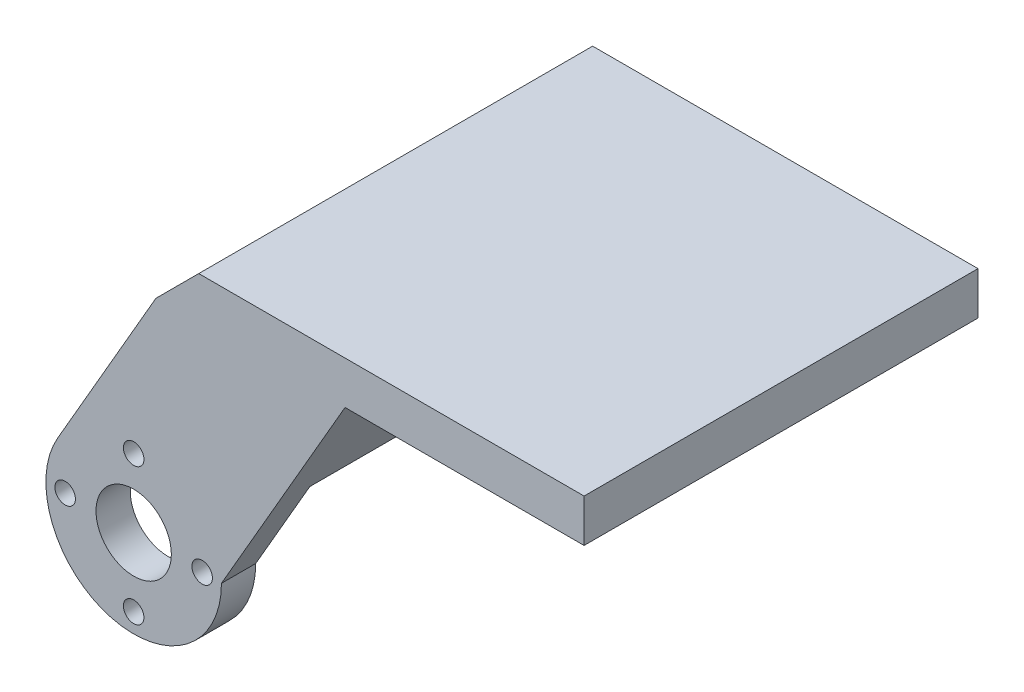
ISO-10303-21;
HEADER;
FILE_DESCRIPTION(('STEP AP214'),'2;1');
FILE_NAME('part.step','',(''),(''),'','','');
FILE_SCHEMA(('AUTOMOTIVE_DESIGN { 1 0 10303 214 1 1 1 1 }'));
ENDSEC;
DATA;
#1=APPLICATION_CONTEXT('core data for automotive mechanical design processes');
#2=APPLICATION_PROTOCOL_DEFINITION('international standard','automotive_design',2000,#1);
#3=PRODUCT_CONTEXT('',#1,'mechanical');
#4=PRODUCT('Part','Part','',(#3));
#5=PRODUCT_RELATED_PRODUCT_CATEGORY('part','',(#4));
#6=PRODUCT_DEFINITION_FORMATION('','',#4);
#7=PRODUCT_DEFINITION_CONTEXT('part definition',#1,'design');
#8=PRODUCT_DEFINITION('design','',#6,#7);
#9=PRODUCT_DEFINITION_SHAPE('','',#8);
#10=(LENGTH_UNIT() NAMED_UNIT(*) SI_UNIT(.MILLI.,.METRE.));
#11=(NAMED_UNIT(*) PLANE_ANGLE_UNIT() SI_UNIT($,.RADIAN.));
#12=(NAMED_UNIT(*) SI_UNIT($,.STERADIAN.) SOLID_ANGLE_UNIT());
#13=UNCERTAINTY_MEASURE_WITH_UNIT(LENGTH_MEASURE(1.E-05),#10,'distance_accuracy_value','');
#14=(GEOMETRIC_REPRESENTATION_CONTEXT(3) GLOBAL_UNCERTAINTY_ASSIGNED_CONTEXT((#13)) GLOBAL_UNIT_ASSIGNED_CONTEXT((#10,
#11,#12)) REPRESENTATION_CONTEXT('',''));
#15=CARTESIAN_POINT('',(0.,0.,0.));
#16=DIRECTION('',(0.,0.,1.));
#17=DIRECTION('',(1.,0.,0.));
#18=AXIS2_PLACEMENT_3D('',#15,#16,#17);
#19=CARTESIAN_POINT('',(0.,0.,-46.));
#20=DIRECTION('',(0.,0.,1.));
#21=DIRECTION('',(1.,0.,0.));
#22=AXIS2_PLACEMENT_3D('',#19,#20,#21);
#23=CYLINDRICAL_SURFACE('',#22,10.25);
#24=CARTESIAN_POINT('',(0.,0.,-4.));
#25=DIRECTION('',(0.,0.,1.));
#26=DIRECTION('',(0.,-1.,0.));
#27=AXIS2_PLACEMENT_3D('',#24,#25,#26);
#28=CIRCLE('',#27,10.25);
#29=CARTESIAN_POINT('',(10.25,0.,-4.));
#30=VERTEX_POINT('',#29);
#31=CARTESIAN_POINT('',(-8.87676038879048,5.12500000000004,-4.));
#32=VERTEX_POINT('',#31);
#33=EDGE_CURVE('E139',#30,#32,#28,.F.);
#34=ORIENTED_EDGE('',*,*,#33,.F.);
#35=DIRECTION('',(0.,0.,1.));
#36=VECTOR('',#35,1.);
#37=CARTESIAN_POINT('',(10.25,0.,-46.));
#38=LINE('',#37,#36);
#39=CARTESIAN_POINT('',(10.25,0.,0.));
#40=VERTEX_POINT('',#39);
#41=EDGE_CURVE('E254',#30,#40,#38,.T.);
#42=ORIENTED_EDGE('',*,*,#41,.T.);
#43=CARTESIAN_POINT('',(0.,0.,0.));
#44=DIRECTION('',(0.,0.,1.));
#45=DIRECTION('',(1.,0.,0.));
#46=AXIS2_PLACEMENT_3D('',#43,#44,#45);
#47=CIRCLE('',#46,10.25);
#48=CARTESIAN_POINT('',(-8.87676038879047,5.12500000000004,0.));
#49=VERTEX_POINT('',#48);
#50=EDGE_CURVE('E274',#49,#40,#47,.T.);
#51=ORIENTED_EDGE('',*,*,#50,.F.);
#52=DIRECTION('',(0.,0.,1.));
#53=VECTOR('',#52,1.);
#54=CARTESIAN_POINT('',(-8.87676038879047,5.12500000000004,-46.));
#55=LINE('',#54,#53);
#56=EDGE_CURVE('E299',#32,#49,#55,.T.);
#57=ORIENTED_EDGE('',*,*,#56,.F.);
#58=EDGE_LOOP('',(#34,#42,#51,#57));
#59=FACE_BOUND('',#58,.T.);
#60=ADVANCED_FACE('F49',(#59),#23,.T.);
#61=CARTESIAN_POINT('',(0.,8.,-46.));
#62=DIRECTION('',(0.,0.,1.));
#63=DIRECTION('',(1.,0.,0.));
#64=AXIS2_PLACEMENT_3D('',#61,#62,#63);
#65=CYLINDRICAL_SURFACE('',#64,1.2);
#66=CARTESIAN_POINT('',(0.,8.,-4.));
#67=DIRECTION('',(0.,0.,1.));
#68=DIRECTION('',(0.,-1.,0.));
#69=AXIS2_PLACEMENT_3D('',#66,#67,#68);
#70=CIRCLE('',#69,1.2);
#71=CARTESIAN_POINT('',(0.,6.8,-4.));
#72=VERTEX_POINT('',#71);
#73=EDGE_CURVE('E206',#72,#72,#70,.F.);
#74=ORIENTED_EDGE('',*,*,#73,.T.);
#75=EDGE_LOOP('',(#74));
#76=FACE_BOUND('',#75,.T.);
#77=CARTESIAN_POINT('',(0.,8.,0.));
#78=DIRECTION('',(0.,0.,1.));
#79=DIRECTION('',(1.,0.,0.));
#80=AXIS2_PLACEMENT_3D('',#77,#78,#79);
#81=CIRCLE('',#80,1.2);
#82=CARTESIAN_POINT('',(1.2,8.,0.));
#83=VERTEX_POINT('',#82);
#84=EDGE_CURVE('E270',#83,#83,#81,.T.);
#85=ORIENTED_EDGE('',*,*,#84,.T.);
#86=EDGE_LOOP('',(#85));
#87=FACE_BOUND('',#86,.T.);
#88=ADVANCED_FACE('F374',(#76,#87),#65,.F.);
#89=CARTESIAN_POINT('',(-8.,0.,-46.));
#90=DIRECTION('',(0.,0.,1.));
#91=DIRECTION('',(1.,0.,0.));
#92=AXIS2_PLACEMENT_3D('',#89,#90,#91);
#93=CYLINDRICAL_SURFACE('',#92,1.2);
#94=CARTESIAN_POINT('',(-8.,0.,-4.));
#95=DIRECTION('',(0.,0.,1.));
#96=DIRECTION('',(0.,-1.,0.));
#97=AXIS2_PLACEMENT_3D('',#94,#95,#96);
#98=CIRCLE('',#97,1.2);
#99=CARTESIAN_POINT('',(-8.,-1.19999999999992,-4.));
#100=VERTEX_POINT('',#99);
#101=EDGE_CURVE('E202',#100,#100,#98,.F.);
#102=ORIENTED_EDGE('',*,*,#101,.T.);
#103=EDGE_LOOP('',(#102));
#104=FACE_BOUND('',#103,.T.);
#105=CARTESIAN_POINT('',(-8.,0.,0.));
#106=DIRECTION('',(0.,0.,1.));
#107=DIRECTION('',(1.,0.,0.));
#108=AXIS2_PLACEMENT_3D('',#105,#106,#107);
#109=CIRCLE('',#108,1.2);
#110=CARTESIAN_POINT('',(-6.8,0.,0.));
#111=VERTEX_POINT('',#110);
#112=EDGE_CURVE('E266',#111,#111,#109,.T.);
#113=ORIENTED_EDGE('',*,*,#112,.T.);
#114=EDGE_LOOP('',(#113));
#115=FACE_BOUND('',#114,.T.);
#116=ADVANCED_FACE('F379',(#104,#115),#93,.F.);
#117=CARTESIAN_POINT('',(0.,-8.,-46.));
#118=DIRECTION('',(0.,0.,1.));
#119=DIRECTION('',(1.,0.,0.));
#120=AXIS2_PLACEMENT_3D('',#117,#118,#119);
#121=CYLINDRICAL_SURFACE('',#120,1.2);
#122=CARTESIAN_POINT('',(0.,-8.,-4.));
#123=DIRECTION('',(0.,0.,1.));
#124=DIRECTION('',(0.,-1.,0.));
#125=AXIS2_PLACEMENT_3D('',#122,#123,#124);
#126=CIRCLE('',#125,1.2);
#127=CARTESIAN_POINT('',(0.,-9.2,-4.));
#128=VERTEX_POINT('',#127);
#129=EDGE_CURVE('E198',#128,#128,#126,.F.);
#130=ORIENTED_EDGE('',*,*,#129,.T.);
#131=EDGE_LOOP('',(#130));
#132=FACE_BOUND('',#131,.T.);
#133=CARTESIAN_POINT('',(0.,-8.,0.));
#134=DIRECTION('',(0.,0.,1.));
#135=DIRECTION('',(1.,0.,0.));
#136=AXIS2_PLACEMENT_3D('',#133,#134,#135);
#137=CIRCLE('',#136,1.2);
#138=CARTESIAN_POINT('',(1.19999999999994,-8.,0.));
#139=VERTEX_POINT('',#138);
#140=EDGE_CURVE('E262',#139,#139,#137,.T.);
#141=ORIENTED_EDGE('',*,*,#140,.T.);
#142=EDGE_LOOP('',(#141));
#143=FACE_BOUND('',#142,.T.);
#144=ADVANCED_FACE('F397',(#132,#143),#121,.F.);
#145=CARTESIAN_POINT('',(8.,0.,-46.));
#146=DIRECTION('',(0.,0.,1.));
#147=DIRECTION('',(1.,0.,0.));
#148=AXIS2_PLACEMENT_3D('',#145,#146,#147);
#149=CYLINDRICAL_SURFACE('',#148,1.2);
#150=CARTESIAN_POINT('',(8.,0.,-4.));
#151=DIRECTION('',(0.,0.,1.));
#152=DIRECTION('',(0.,-1.,0.));
#153=AXIS2_PLACEMENT_3D('',#150,#151,#152);
#154=CIRCLE('',#153,1.2);
#155=CARTESIAN_POINT('',(8.,-1.20000000000003,-4.));
#156=VERTEX_POINT('',#155);
#157=EDGE_CURVE('E194',#156,#156,#154,.F.);
#158=ORIENTED_EDGE('',*,*,#157,.T.);
#159=EDGE_LOOP('',(#158));
#160=FACE_BOUND('',#159,.T.);
#161=CARTESIAN_POINT('',(8.,0.,0.));
#162=DIRECTION('',(0.,0.,1.));
#163=DIRECTION('',(1.,0.,0.));
#164=AXIS2_PLACEMENT_3D('',#161,#162,#163);
#165=CIRCLE('',#164,1.2);
#166=CARTESIAN_POINT('',(9.2,0.,0.));
#167=VERTEX_POINT('',#166);
#168=EDGE_CURVE('E258',#167,#167,#165,.T.);
#169=ORIENTED_EDGE('',*,*,#168,.T.);
#170=EDGE_LOOP('',(#169));
#171=FACE_BOUND('',#170,.T.);
#172=ADVANCED_FACE('F391',(#160,#171),#149,.F.);
#173=CARTESIAN_POINT('',(0.,0.,-46.));
#174=DIRECTION('',(0.,0.,1.));
#175=DIRECTION('',(1.,0.,0.));
#176=AXIS2_PLACEMENT_3D('',#173,#174,#175);
#177=CYLINDRICAL_SURFACE('',#176,4.4);
#178=CARTESIAN_POINT('',(0.,0.,-4.));
#179=DIRECTION('',(0.,0.,1.));
#180=DIRECTION('',(0.,-1.,0.));
#181=AXIS2_PLACEMENT_3D('',#178,#179,#180);
#182=CIRCLE('',#181,4.4);
#183=CARTESIAN_POINT('',(0.,-4.4,-4.));
#184=VERTEX_POINT('',#183);
#185=EDGE_CURVE('E190',#184,#184,#182,.F.);
#186=ORIENTED_EDGE('',*,*,#185,.T.);
#187=EDGE_LOOP('',(#186));
#188=FACE_BOUND('',#187,.T.);
#189=CARTESIAN_POINT('',(0.,0.,0.));
#190=DIRECTION('',(0.,0.,1.));
#191=DIRECTION('',(1.,0.,0.));
#192=AXIS2_PLACEMENT_3D('',#189,#190,#191);
#193=CIRCLE('',#192,4.4);
#194=CARTESIAN_POINT('',(4.4,0.,0.));
#195=VERTEX_POINT('',#194);
#196=EDGE_CURVE('E210',#195,#195,#193,.T.);
#197=ORIENTED_EDGE('',*,*,#196,.T.);
#198=EDGE_LOOP('',(#197));
#199=FACE_BOUND('',#198,.T.);
#200=ADVANCED_FACE('F384',(#188,#199),#177,.F.);
#201=CARTESIAN_POINT('',(10.25,0.,-46.));
#202=VERTEX_POINT('',#201);
#203=CARTESIAN_POINT('',(10.25,0.,-42.));
#204=VERTEX_POINT('',#203);
#205=EDGE_CURVE('E313',#202,#204,#38,.T.);
#206=ORIENTED_EDGE('',*,*,#205,.T.);
#207=CARTESIAN_POINT('',(0.,0.,-42.));
#208=DIRECTION('',(0.,0.,-1.));
#209=DIRECTION('',(-1.,0.,0.));
#210=AXIS2_PLACEMENT_3D('',#207,#208,#209);
#211=CIRCLE('',#210,10.25);
#212=CARTESIAN_POINT('',(-8.87676038879048,5.12500000000004,-42.));
#213=VERTEX_POINT('',#212);
#214=EDGE_CURVE('E164',#213,#204,#211,.F.);
#215=ORIENTED_EDGE('',*,*,#214,.F.);
#216=CARTESIAN_POINT('',(-8.87676038879047,5.12500000000004,-46.));
#217=VERTEX_POINT('',#216);
#218=EDGE_CURVE('E296',#217,#213,#55,.T.);
#219=ORIENTED_EDGE('',*,*,#218,.F.);
#220=CARTESIAN_POINT('',(0.,0.,-46.));
#221=DIRECTION('',(0.,0.,1.));
#222=DIRECTION('',(1.,0.,0.));
#223=AXIS2_PLACEMENT_3D('',#220,#221,#222);
#224=CIRCLE('',#223,10.25);
#225=EDGE_CURVE('E232',#217,#202,#224,.T.);
#226=ORIENTED_EDGE('',*,*,#225,.T.);
#227=EDGE_LOOP('',(#206,#215,#219,#226));
#228=FACE_BOUND('',#227,.T.);
#229=ADVANCED_FACE('F355',(#228),#23,.T.);
#230=CARTESIAN_POINT('',(-8.87676038879048,5.12500000000004,-46.));
#231=DIRECTION('',(0.866025403784436,-0.500000000000004,0.));
#232=DIRECTION('',(0.500000000000004,0.866025403784436,0.));
#233=AXIS2_PLACEMENT_3D('',#230,#231,#232);
#234=PLANE('',#233);
#235=DIRECTION('',(0.,0.,-1.));
#236=VECTOR('',#235,1.);
#237=CARTESIAN_POINT('',(-0.00176038879040434,20.4969509171738,-4.));
#238=LINE('',#237,#236);
#239=CARTESIAN_POINT('',(-0.00176038879040434,20.4969509171738,-4.));
#240=VERTEX_POINT('',#239);
#241=CARTESIAN_POINT('',(-0.00176038879040608,20.4969509171738,-42.));
#242=VERTEX_POINT('',#241);
#243=EDGE_CURVE('E144',#240,#242,#238,.T.);
#244=ORIENTED_EDGE('',*,*,#243,.F.);
#245=DIRECTION('',(0.500000000000004,0.866025403784436,0.));
#246=VECTOR('',#245,1.);
#247=CARTESIAN_POINT('',(-14.0017603887905,-3.75176038879043,-4.));
#248=LINE('',#247,#246);
#249=EDGE_CURVE('E132',#32,#240,#248,.T.);
#250=ORIENTED_EDGE('',*,*,#249,.F.);
#251=ORIENTED_EDGE('',*,*,#56,.T.);
#252=DIRECTION('',(0.500000000000004,0.866025403784436,0.));
#253=VECTOR('',#252,1.);
#254=CARTESIAN_POINT('',(-8.87676038879048,5.12500000000004,0.));
#255=LINE('',#254,#253);
#256=CARTESIAN_POINT('',(2.59807621135343,25.,0.));
#257=VERTEX_POINT('',#256);
#258=EDGE_CURVE('E216',#49,#257,#255,.T.);
#259=ORIENTED_EDGE('',*,*,#258,.T.);
#260=DIRECTION('',(0.,0.,1.));
#261=VECTOR('',#260,1.);
#262=CARTESIAN_POINT('',(2.59807621135343,25.,-46.));
#263=LINE('',#262,#261);
#264=CARTESIAN_POINT('',(2.59807621135343,25.,-46.));
#265=VERTEX_POINT('',#264);
#266=EDGE_CURVE('E300',#265,#257,#263,.T.);
#267=ORIENTED_EDGE('',*,*,#266,.F.);
#268=DIRECTION('',(0.500000000000004,0.866025403784436,0.));
#269=VECTOR('',#268,1.);
#270=CARTESIAN_POINT('',(-8.87676038879048,5.12500000000004,-46.));
#271=LINE('',#270,#269);
#272=EDGE_CURVE('E251',#217,#265,#271,.T.);
#273=ORIENTED_EDGE('',*,*,#272,.F.);
#274=ORIENTED_EDGE('',*,*,#218,.T.);
#275=DIRECTION('',(-0.500000000000004,-0.866025403784436,0.));
#276=VECTOR('',#275,1.);
#277=CARTESIAN_POINT('',(-14.0017603887905,-3.75176038879043,-42.));
#278=LINE('',#277,#276);
#279=EDGE_CURVE('E154',#242,#213,#278,.T.);
#280=ORIENTED_EDGE('',*,*,#279,.F.);
#281=EDGE_LOOP('',(#244,#250,#251,#259,#267,#273,#274,#280));
#282=FACE_BOUND('',#281,.T.);
#283=ADVANCED_FACE('F156',(#282),#234,.F.);
#284=CARTESIAN_POINT('',(0.,30.,-46.));
#285=DIRECTION('',(0.,-1.,0.));
#286=DIRECTION('',(1.,0.,0.));
#287=AXIS2_PLACEMENT_3D('',#284,#285,#286);
#288=PLANE('',#287);
#289=DIRECTION('',(1.,0.,0.));
#290=VECTOR('',#289,1.);
#291=CARTESIAN_POINT('',(0.,30.,-46.));
#292=LINE('',#291,#290);
#293=CARTESIAN_POINT('',(7.59807621135343,30.,-46.));
#294=VERTEX_POINT('',#293);
#295=CARTESIAN_POINT('',(52.5980762113534,30.,-46.));
#296=VERTEX_POINT('',#295);
#297=EDGE_CURVE('E248',#294,#296,#292,.T.);
#298=ORIENTED_EDGE('',*,*,#297,.F.);
#299=DIRECTION('',(0.,0.,1.));
#300=VECTOR('',#299,1.);
#301=CARTESIAN_POINT('',(7.59807621135343,30.,-46.));
#302=LINE('',#301,#300);
#303=CARTESIAN_POINT('',(7.59807621135343,30.,0.));
#304=VERTEX_POINT('',#303);
#305=EDGE_CURVE('E326',#294,#304,#302,.T.);
#306=ORIENTED_EDGE('',*,*,#305,.T.);
#307=DIRECTION('',(1.,0.,0.));
#308=VECTOR('',#307,1.);
#309=CARTESIAN_POINT('',(0.,30.,0.));
#310=LINE('',#309,#308);
#311=CARTESIAN_POINT('',(52.5980762113534,30.,0.));
#312=VERTEX_POINT('',#311);
#313=EDGE_CURVE('E290',#304,#312,#310,.T.);
#314=ORIENTED_EDGE('',*,*,#313,.T.);
#315=DIRECTION('',(0.,0.,1.));
#316=VECTOR('',#315,1.);
#317=CARTESIAN_POINT('',(52.5980762113534,30.,-46.));
#318=LINE('',#317,#316);
#319=EDGE_CURVE('E303',#296,#312,#318,.T.);
#320=ORIENTED_EDGE('',*,*,#319,.F.);
#321=EDGE_LOOP('',(#298,#306,#314,#320));
#322=FACE_BOUND('',#321,.T.);
#323=ADVANCED_FACE('F337',(#322),#288,.F.);
#324=CARTESIAN_POINT('',(52.5980762113535,0.,-46.));
#325=DIRECTION('',(1.,0.,0.));
#326=DIRECTION('',(0.,1.,0.));
#327=AXIS2_PLACEMENT_3D('',#324,#325,#326);
#328=PLANE('',#327);
#329=DIRECTION('',(0.,1.,0.));
#330=VECTOR('',#329,1.);
#331=CARTESIAN_POINT('',(52.5980762113535,0.,0.));
#332=LINE('',#331,#330);
#333=CARTESIAN_POINT('',(52.5980762113534,25.,0.));
#334=VERTEX_POINT('',#333);
#335=EDGE_CURVE('E286',#334,#312,#332,.T.);
#336=ORIENTED_EDGE('',*,*,#335,.F.);
#337=DIRECTION('',(0.,0.,1.));
#338=VECTOR('',#337,1.);
#339=CARTESIAN_POINT('',(52.5980762113534,25.,-46.));
#340=LINE('',#339,#338);
#341=CARTESIAN_POINT('',(52.5980762113534,25.,-46.));
#342=VERTEX_POINT('',#341);
#343=EDGE_CURVE('E307',#342,#334,#340,.T.);
#344=ORIENTED_EDGE('',*,*,#343,.F.);
#345=DIRECTION('',(0.,1.,0.));
#346=VECTOR('',#345,1.);
#347=CARTESIAN_POINT('',(52.5980762113535,0.,-46.));
#348=LINE('',#347,#346);
#349=EDGE_CURVE('E244',#342,#296,#348,.T.);
#350=ORIENTED_EDGE('',*,*,#349,.T.);
#351=ORIENTED_EDGE('',*,*,#319,.T.);
#352=EDGE_LOOP('',(#336,#344,#350,#351));
#353=FACE_BOUND('',#352,.T.);
#354=ADVANCED_FACE('F363',(#353),#328,.T.);
#355=CARTESIAN_POINT('',(0.,25.,-46.));
#356=DIRECTION('',(0.,-1.,0.));
#357=DIRECTION('',(0.,0.,-1.));
#358=AXIS2_PLACEMENT_3D('',#355,#356,#357);
#359=PLANE('',#358);
#360=DIRECTION('',(1.,0.,0.));
#361=VECTOR('',#360,1.);
#362=CARTESIAN_POINT('',(0.,25.,0.));
#363=LINE('',#362,#361);
#364=CARTESIAN_POINT('',(24.6837567297408,25.,0.));
#365=VERTEX_POINT('',#364);
#366=EDGE_CURVE('E282',#365,#334,#363,.T.);
#367=ORIENTED_EDGE('',*,*,#366,.F.);
#368=DIRECTION('',(0.,0.,1.));
#369=VECTOR('',#368,1.);
#370=CARTESIAN_POINT('',(24.6837567297408,25.,-46.));
#371=LINE('',#370,#369);
#372=CARTESIAN_POINT('',(24.6837567297408,25.,-46.));
#373=VERTEX_POINT('',#372);
#374=EDGE_CURVE('E310',#373,#365,#371,.T.);
#375=ORIENTED_EDGE('',*,*,#374,.F.);
#376=DIRECTION('',(1.,0.,0.));
#377=VECTOR('',#376,1.);
#378=CARTESIAN_POINT('',(0.,25.,-46.));
#379=LINE('',#378,#377);
#380=EDGE_CURVE('E240',#373,#342,#379,.T.);
#381=ORIENTED_EDGE('',*,*,#380,.T.);
#382=ORIENTED_EDGE('',*,*,#343,.T.);
#383=EDGE_LOOP('',(#367,#375,#381,#382));
#384=FACE_BOUND('',#383,.T.);
#385=ADVANCED_FACE('F346',(#384),#359,.T.);
#386=CARTESIAN_POINT('',(0.,8.,-42.));
#387=DIRECTION('',(0.,0.,-1.));
#388=DIRECTION('',(-1.,0.,0.));
#389=AXIS2_PLACEMENT_3D('',#386,#387,#388);
#390=CIRCLE('',#389,1.2);
#391=CARTESIAN_POINT('',(-1.2,8.,-42.));
#392=VERTEX_POINT('',#391);
#393=EDGE_CURVE('E184',#392,#392,#390,.F.);
#394=ORIENTED_EDGE('',*,*,#393,.T.);
#395=EDGE_LOOP('',(#394));
#396=FACE_BOUND('',#395,.T.);
#397=CARTESIAN_POINT('',(0.,8.,-46.));
#398=DIRECTION('',(0.,0.,1.));
#399=DIRECTION('',(1.,0.,0.));
#400=AXIS2_PLACEMENT_3D('',#397,#398,#399);
#401=CIRCLE('',#400,1.2);
#402=CARTESIAN_POINT('',(1.2,8.,-46.));
#403=VERTEX_POINT('',#402);
#404=EDGE_CURVE('E228',#403,#403,#401,.T.);
#405=ORIENTED_EDGE('',*,*,#404,.F.);
#406=EDGE_LOOP('',(#405));
#407=FACE_BOUND('',#406,.T.);
#408=ADVANCED_FACE('F369',(#396,#407),#65,.F.);
#409=CARTESIAN_POINT('',(-8.,0.,-42.));
#410=DIRECTION('',(0.,0.,-1.));
#411=DIRECTION('',(-1.,0.,0.));
#412=AXIS2_PLACEMENT_3D('',#409,#410,#411);
#413=CIRCLE('',#412,1.2);
#414=CARTESIAN_POINT('',(-9.2,0.,-42.));
#415=VERTEX_POINT('',#414);
#416=EDGE_CURVE('E180',#415,#415,#413,.F.);
#417=ORIENTED_EDGE('',*,*,#416,.T.);
#418=EDGE_LOOP('',(#417));
#419=FACE_BOUND('',#418,.T.);
#420=CARTESIAN_POINT('',(-8.,0.,-46.));
#421=DIRECTION('',(0.,0.,1.));
#422=DIRECTION('',(1.,0.,0.));
#423=AXIS2_PLACEMENT_3D('',#420,#421,#422);
#424=CIRCLE('',#423,1.2);
#425=CARTESIAN_POINT('',(-6.8,0.,-46.));
#426=VERTEX_POINT('',#425);
#427=EDGE_CURVE('E224',#426,#426,#424,.T.);
#428=ORIENTED_EDGE('',*,*,#427,.F.);
#429=EDGE_LOOP('',(#428));
#430=FACE_BOUND('',#429,.T.);
#431=ADVANCED_FACE('F425',(#419,#430),#93,.F.);
#432=CARTESIAN_POINT('',(0.,-8.,-42.));
#433=DIRECTION('',(0.,0.,-1.));
#434=DIRECTION('',(-1.,0.,0.));
#435=AXIS2_PLACEMENT_3D('',#432,#433,#434);
#436=CIRCLE('',#435,1.2);
#437=CARTESIAN_POINT('',(-1.20000000000006,-8.,-42.));
#438=VERTEX_POINT('',#437);
#439=EDGE_CURVE('E176',#438,#438,#436,.F.);
#440=ORIENTED_EDGE('',*,*,#439,.T.);
#441=EDGE_LOOP('',(#440));
#442=FACE_BOUND('',#441,.T.);
#443=CARTESIAN_POINT('',(0.,-8.,-46.));
#444=DIRECTION('',(0.,0.,1.));
#445=DIRECTION('',(1.,0.,0.));
#446=AXIS2_PLACEMENT_3D('',#443,#444,#445);
#447=CIRCLE('',#446,1.2);
#448=CARTESIAN_POINT('',(1.19999999999994,-8.,-46.));
#449=VERTEX_POINT('',#448);
#450=EDGE_CURVE('E220',#449,#449,#447,.T.);
#451=ORIENTED_EDGE('',*,*,#450,.F.);
#452=EDGE_LOOP('',(#451));
#453=FACE_BOUND('',#452,.T.);
#454=ADVANCED_FACE('F408',(#442,#453),#121,.F.);
#455=CARTESIAN_POINT('',(8.,0.,-42.));
#456=DIRECTION('',(0.,0.,-1.));
#457=DIRECTION('',(-1.,0.,0.));
#458=AXIS2_PLACEMENT_3D('',#455,#456,#457);
#459=CIRCLE('',#458,1.2);
#460=CARTESIAN_POINT('',(6.8,0.,-42.));
#461=VERTEX_POINT('',#460);
#462=EDGE_CURVE('E172',#461,#461,#459,.F.);
#463=ORIENTED_EDGE('',*,*,#462,.T.);
#464=EDGE_LOOP('',(#463));
#465=FACE_BOUND('',#464,.T.);
#466=CARTESIAN_POINT('',(8.,0.,-46.));
#467=DIRECTION('',(0.,0.,1.));
#468=DIRECTION('',(1.,0.,0.));
#469=AXIS2_PLACEMENT_3D('',#466,#467,#468);
#470=CIRCLE('',#469,1.2);
#471=CARTESIAN_POINT('',(9.2,0.,-46.));
#472=VERTEX_POINT('',#471);
#473=EDGE_CURVE('E215',#472,#472,#470,.T.);
#474=ORIENTED_EDGE('',*,*,#473,.F.);
#475=EDGE_LOOP('',(#474));
#476=FACE_BOUND('',#475,.T.);
#477=ADVANCED_FACE('F400',(#465,#476),#149,.F.);
#478=CARTESIAN_POINT('',(0.,0.,-42.));
#479=DIRECTION('',(0.,0.,-1.));
#480=DIRECTION('',(-1.,0.,0.));
#481=AXIS2_PLACEMENT_3D('',#478,#479,#480);
#482=CIRCLE('',#481,4.4);
#483=CARTESIAN_POINT('',(-4.4,0.,-42.));
#484=VERTEX_POINT('',#483);
#485=EDGE_CURVE('E168',#484,#484,#482,.F.);
#486=ORIENTED_EDGE('',*,*,#485,.T.);
#487=EDGE_LOOP('',(#486));
#488=FACE_BOUND('',#487,.T.);
#489=CARTESIAN_POINT('',(0.,0.,-46.));
#490=DIRECTION('',(0.,0.,1.));
#491=DIRECTION('',(1.,0.,0.));
#492=AXIS2_PLACEMENT_3D('',#489,#490,#491);
#493=CIRCLE('',#492,4.4);
#494=CARTESIAN_POINT('',(4.4,0.,-46.));
#495=VERTEX_POINT('',#494);
#496=EDGE_CURVE('E211',#495,#495,#493,.T.);
#497=ORIENTED_EDGE('',*,*,#496,.F.);
#498=EDGE_LOOP('',(#497));
#499=FACE_BOUND('',#498,.T.);
#500=ADVANCED_FACE('F393',(#488,#499),#177,.F.);
#501=CARTESIAN_POINT('',(7.68749999999996,-4.43838019439527,-46.));
#502=DIRECTION('',(0.866025403784436,-0.500000000000004,0.));
#503=DIRECTION('',(0.500000000000004,0.866025403784436,0.));
#504=AXIS2_PLACEMENT_3D('',#501,#502,#503);
#505=PLANE('',#504);
#506=DIRECTION('',(-0.500000000000004,-0.866025403784436,0.));
#507=VECTOR('',#506,1.);
#508=CARTESIAN_POINT('',(7.68749999999996,-4.43838019439528,-4.));
#509=LINE('',#508,#507);
#510=CARTESIAN_POINT('',(16.5625,10.9335707227785,-4.));
#511=VERTEX_POINT('',#510);
#512=EDGE_CURVE('E323',#511,#30,#509,.T.);
#513=ORIENTED_EDGE('',*,*,#512,.F.);
#514=DIRECTION('',(0.,0.,1.));
#515=VECTOR('',#514,1.);
#516=CARTESIAN_POINT('',(16.5625,10.9335707227785,-46.));
#517=LINE('',#516,#515);
#518=CARTESIAN_POINT('',(16.5625,10.9335707227785,-42.));
#519=VERTEX_POINT('',#518);
#520=EDGE_CURVE('E151',#519,#511,#517,.T.);
#521=ORIENTED_EDGE('',*,*,#520,.F.);
#522=DIRECTION('',(0.500000000000004,0.866025403784436,0.));
#523=VECTOR('',#522,1.);
#524=CARTESIAN_POINT('',(7.68749999999996,-4.43838019439527,-42.));
#525=LINE('',#524,#523);
#526=EDGE_CURVE('E319',#204,#519,#525,.T.);
#527=ORIENTED_EDGE('',*,*,#526,.F.);
#528=ORIENTED_EDGE('',*,*,#205,.F.);
#529=DIRECTION('',(0.500000000000004,0.866025403784436,0.));
#530=VECTOR('',#529,1.);
#531=CARTESIAN_POINT('',(7.68749999999996,-4.43838019439527,-46.));
#532=LINE('',#531,#530);
#533=EDGE_CURVE('E236',#202,#373,#532,.T.);
#534=ORIENTED_EDGE('',*,*,#533,.T.);
#535=ORIENTED_EDGE('',*,*,#374,.T.);
#536=DIRECTION('',(0.500000000000004,0.866025403784436,0.));
#537=VECTOR('',#536,1.);
#538=CARTESIAN_POINT('',(7.68749999999996,-4.43838019439527,0.));
#539=LINE('',#538,#537);
#540=EDGE_CURVE('E278',#40,#365,#539,.T.);
#541=ORIENTED_EDGE('',*,*,#540,.F.);
#542=ORIENTED_EDGE('',*,*,#41,.F.);
#543=EDGE_LOOP('',(#513,#521,#527,#528,#534,#535,#541,#542));
#544=FACE_BOUND('',#543,.T.);
#545=ADVANCED_FACE('F350',(#544),#505,.T.);
#546=CARTESIAN_POINT('',(0.,0.,-46.));
#547=DIRECTION('',(0.,0.,1.));
#548=DIRECTION('',(1.,0.,0.));
#549=AXIS2_PLACEMENT_3D('',#546,#547,#548);
#550=PLANE('',#549);
#551=ORIENTED_EDGE('',*,*,#496,.T.);
#552=EDGE_LOOP('',(#551));
#553=FACE_BOUND('',#552,.T.);
#554=ORIENTED_EDGE('',*,*,#473,.T.);
#555=EDGE_LOOP('',(#554));
#556=FACE_BOUND('',#555,.T.);
#557=ORIENTED_EDGE('',*,*,#450,.T.);
#558=EDGE_LOOP('',(#557));
#559=FACE_BOUND('',#558,.T.);
#560=ORIENTED_EDGE('',*,*,#427,.T.);
#561=EDGE_LOOP('',(#560));
#562=FACE_BOUND('',#561,.T.);
#563=ORIENTED_EDGE('',*,*,#404,.T.);
#564=EDGE_LOOP('',(#563));
#565=FACE_BOUND('',#564,.T.);
#566=ORIENTED_EDGE('',*,*,#272,.T.);
#567=DIRECTION('',(-0.707106781186546,-0.707106781186549,0.));
#568=VECTOR('',#567,1.);
#569=CARTESIAN_POINT('',(7.59807621135343,30.,-46.));
#570=LINE('',#569,#568);
#571=EDGE_CURVE('E11',#265,#294,#570,.F.);
#572=ORIENTED_EDGE('',*,*,#571,.T.);
#573=ORIENTED_EDGE('',*,*,#297,.T.);
#574=ORIENTED_EDGE('',*,*,#349,.F.);
#575=ORIENTED_EDGE('',*,*,#380,.F.);
#576=ORIENTED_EDGE('',*,*,#533,.F.);
#577=ORIENTED_EDGE('',*,*,#225,.F.);
#578=EDGE_LOOP('',(#566,#572,#573,#574,#575,#576,#577));
#579=FACE_BOUND('',#578,.T.);
#580=ADVANCED_FACE('F340',(#553,#556,#559,#562,#565,#579),#550,.F.);
#581=CARTESIAN_POINT('',(0.,0.,0.));
#582=DIRECTION('',(0.,0.,1.));
#583=DIRECTION('',(1.,0.,0.));
#584=AXIS2_PLACEMENT_3D('',#581,#582,#583);
#585=PLANE('',#584);
#586=ORIENTED_EDGE('',*,*,#196,.F.);
#587=EDGE_LOOP('',(#586));
#588=FACE_BOUND('',#587,.T.);
#589=ORIENTED_EDGE('',*,*,#168,.F.);
#590=EDGE_LOOP('',(#589));
#591=FACE_BOUND('',#590,.T.);
#592=ORIENTED_EDGE('',*,*,#140,.F.);
#593=EDGE_LOOP('',(#592));
#594=FACE_BOUND('',#593,.T.);
#595=ORIENTED_EDGE('',*,*,#112,.F.);
#596=EDGE_LOOP('',(#595));
#597=FACE_BOUND('',#596,.T.);
#598=ORIENTED_EDGE('',*,*,#84,.F.);
#599=EDGE_LOOP('',(#598));
#600=FACE_BOUND('',#599,.T.);
#601=ORIENTED_EDGE('',*,*,#313,.F.);
#602=DIRECTION('',(0.707106781186546,0.707106781186549,0.));
#603=VECTOR('',#602,1.);
#604=CARTESIAN_POINT('',(-11.2009618943233,11.2009618943232,0.));
#605=LINE('',#604,#603);
#606=EDGE_CURVE('E59',#304,#257,#605,.F.);
#607=ORIENTED_EDGE('',*,*,#606,.T.);
#608=ORIENTED_EDGE('',*,*,#258,.F.);
#609=ORIENTED_EDGE('',*,*,#50,.T.);
#610=ORIENTED_EDGE('',*,*,#540,.T.);
#611=ORIENTED_EDGE('',*,*,#366,.T.);
#612=ORIENTED_EDGE('',*,*,#335,.T.);
#613=EDGE_LOOP('',(#601,#607,#608,#609,#610,#611,#612));
#614=FACE_BOUND('',#613,.T.);
#615=ADVANCED_FACE('F332',(#588,#591,#594,#597,#600,#614),#585,.T.);
#616=CARTESIAN_POINT('',(38.7619373529101,-34.2148954834016,-4.));
#617=DIRECTION('',(0.,0.,1.));
#618=DIRECTION('',(0.,-1.,0.));
#619=AXIS2_PLACEMENT_3D('',#616,#617,#618);
#620=PLANE('',#619);
#621=ORIENTED_EDGE('',*,*,#101,.F.);
#622=EDGE_LOOP('',(#621));
#623=FACE_BOUND('',#622,.T.);
#624=ORIENTED_EDGE('',*,*,#157,.F.);
#625=EDGE_LOOP('',(#624));
#626=FACE_BOUND('',#625,.T.);
#627=ORIENTED_EDGE('',*,*,#33,.T.);
#628=ORIENTED_EDGE('',*,*,#249,.T.);
#629=DIRECTION('',(-0.866025403784436,0.500000000000004,0.));
#630=VECTOR('',#629,1.);
#631=CARTESIAN_POINT('',(52.7619373529102,-9.96618417743742,-4.));
#632=LINE('',#631,#630);
#633=EDGE_CURVE('E137',#511,#240,#632,.T.);
#634=ORIENTED_EDGE('',*,*,#633,.F.);
#635=ORIENTED_EDGE('',*,*,#512,.T.);
#636=EDGE_LOOP('',(#627,#628,#634,#635));
#637=FACE_BOUND('',#636,.T.);
#638=ORIENTED_EDGE('',*,*,#185,.F.);
#639=EDGE_LOOP('',(#638));
#640=FACE_BOUND('',#639,.T.);
#641=ORIENTED_EDGE('',*,*,#129,.F.);
#642=EDGE_LOOP('',(#641));
#643=FACE_BOUND('',#642,.T.);
#644=ORIENTED_EDGE('',*,*,#73,.F.);
#645=EDGE_LOOP('',(#644));
#646=FACE_BOUND('',#645,.T.);
#647=ADVANCED_FACE('F134',(#623,#626,#637,#640,#643,#646),#620,.F.);
#648=CARTESIAN_POINT('',(38.7619373529101,-34.2148954834017,-42.));
#649=DIRECTION('',(0.,0.,-1.));
#650=DIRECTION('',(-1.,0.,0.));
#651=AXIS2_PLACEMENT_3D('',#648,#649,#650);
#652=PLANE('',#651);
#653=ORIENTED_EDGE('',*,*,#416,.F.);
#654=EDGE_LOOP('',(#653));
#655=FACE_BOUND('',#654,.T.);
#656=ORIENTED_EDGE('',*,*,#462,.F.);
#657=EDGE_LOOP('',(#656));
#658=FACE_BOUND('',#657,.T.);
#659=ORIENTED_EDGE('',*,*,#214,.T.);
#660=ORIENTED_EDGE('',*,*,#526,.T.);
#661=DIRECTION('',(-0.866025403784436,0.500000000000004,0.));
#662=VECTOR('',#661,1.);
#663=CARTESIAN_POINT('',(52.7619373529102,-9.96618417743743,-42.));
#664=LINE('',#663,#662);
#665=EDGE_CURVE('E153',#519,#242,#664,.T.);
#666=ORIENTED_EDGE('',*,*,#665,.T.);
#667=ORIENTED_EDGE('',*,*,#279,.T.);
#668=EDGE_LOOP('',(#659,#660,#666,#667));
#669=FACE_BOUND('',#668,.T.);
#670=ORIENTED_EDGE('',*,*,#485,.F.);
#671=EDGE_LOOP('',(#670));
#672=FACE_BOUND('',#671,.T.);
#673=ORIENTED_EDGE('',*,*,#439,.F.);
#674=EDGE_LOOP('',(#673));
#675=FACE_BOUND('',#674,.T.);
#676=ORIENTED_EDGE('',*,*,#393,.F.);
#677=EDGE_LOOP('',(#676));
#678=FACE_BOUND('',#677,.T.);
#679=ADVANCED_FACE('F358',(#655,#658,#669,#672,#675,#678),#652,.F.);
#680=CARTESIAN_POINT('',(52.7619373529102,-9.96618417743742,-4.));
#681=DIRECTION('',(0.500000000000004,0.866025403784436,0.));
#682=DIRECTION('',(-0.866025403784436,0.500000000000004,0.));
#683=AXIS2_PLACEMENT_3D('',#680,#681,#682);
#684=PLANE('',#683);
#685=ORIENTED_EDGE('',*,*,#520,.T.);
#686=ORIENTED_EDGE('',*,*,#633,.T.);
#687=ORIENTED_EDGE('',*,*,#243,.T.);
#688=ORIENTED_EDGE('',*,*,#665,.F.);
#689=EDGE_LOOP('',(#685,#686,#687,#688));
#690=FACE_BOUND('',#689,.T.);
#691=ADVANCED_FACE('F148',(#690),#684,.F.);
#692=CARTESIAN_POINT('',(7.59807621135343,30.,-46.));
#693=DIRECTION('',(0.707106781186549,-0.707106781186546,0.));
#694=DIRECTION('',(0.,0.,1.));
#695=AXIS2_PLACEMENT_3D('',#692,#693,#694);
#696=PLANE('',#695);
#697=ORIENTED_EDGE('',*,*,#571,.F.);
#698=ORIENTED_EDGE('',*,*,#266,.T.);
#699=ORIENTED_EDGE('',*,*,#606,.F.);
#700=ORIENTED_EDGE('',*,*,#305,.F.);
#701=EDGE_LOOP('',(#697,#698,#699,#700));
#702=FACE_BOUND('',#701,.T.);
#703=ADVANCED_FACE('F52',(#702),#696,.F.);
#704=CLOSED_SHELL('',(#60,#88,#116,#144,#172,#200,#229,#283,#323,#354,#385,#408,#431,#454,#477,
#500,#545,#580,#615,#647,#679,#691,#703));
#705=MANIFOLD_SOLID_BREP('B2',#704);
#706=ADVANCED_BREP_SHAPE_REPRESENTATION('',(#18,#705),#14);
#707=SHAPE_DEFINITION_REPRESENTATION(#9,#706);
ENDSEC;
END-ISO-10303-21;
